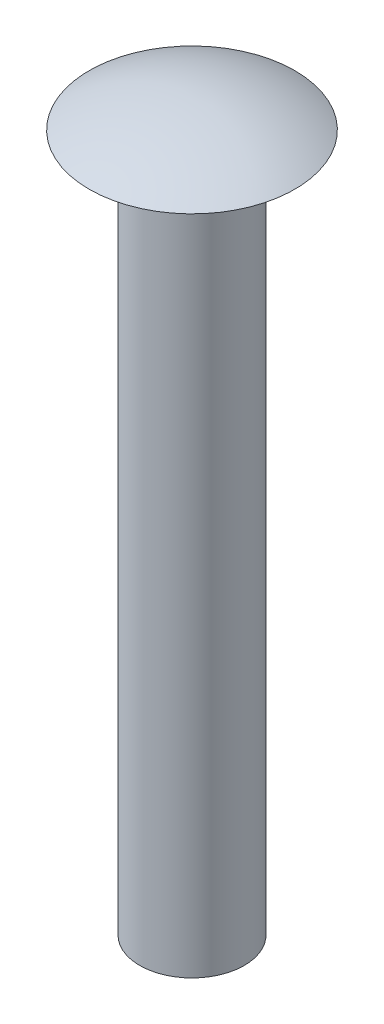
ISO-10303-21;
HEADER;
FILE_DESCRIPTION(('STEP AP214'),'2;1');
FILE_NAME('part.step','',(''),(''),'','','');
FILE_SCHEMA(('AUTOMOTIVE_DESIGN { 1 0 10303 214 1 1 1 1 }'));
ENDSEC;
DATA;
#1=APPLICATION_CONTEXT('core data for automotive mechanical design processes');
#2=APPLICATION_PROTOCOL_DEFINITION('international standard','automotive_design',2000,#1);
#3=PRODUCT_CONTEXT('',#1,'mechanical');
#4=PRODUCT('Part','Part','',(#3));
#5=PRODUCT_RELATED_PRODUCT_CATEGORY('part','',(#4));
#6=PRODUCT_DEFINITION_FORMATION('','',#4);
#7=PRODUCT_DEFINITION_CONTEXT('part definition',#1,'design');
#8=PRODUCT_DEFINITION('design','',#6,#7);
#9=PRODUCT_DEFINITION_SHAPE('','',#8);
#10=(LENGTH_UNIT() NAMED_UNIT(*) SI_UNIT(.MILLI.,.METRE.));
#11=(NAMED_UNIT(*) PLANE_ANGLE_UNIT() SI_UNIT($,.RADIAN.));
#12=(NAMED_UNIT(*) SI_UNIT($,.STERADIAN.) SOLID_ANGLE_UNIT());
#13=UNCERTAINTY_MEASURE_WITH_UNIT(LENGTH_MEASURE(1.E-05),#10,'distance_accuracy_value','');
#14=(GEOMETRIC_REPRESENTATION_CONTEXT(3) GLOBAL_UNCERTAINTY_ASSIGNED_CONTEXT((#13)) GLOBAL_UNIT_ASSIGNED_CONTEXT((#10,
#11,#12)) REPRESENTATION_CONTEXT('',''));
#15=CARTESIAN_POINT('',(0.,0.,0.));
#16=DIRECTION('',(0.,0.,1.));
#17=DIRECTION('',(1.,0.,0.));
#18=AXIS2_PLACEMENT_3D('',#15,#16,#17);
#19=CARTESIAN_POINT('',(0.,7.17329545454546,0.));
#20=DIRECTION('',(0.,-1.,0.));
#21=DIRECTION('',(0.,0.,-1.));
#22=AXIS2_PLACEMENT_3D('',#19,#20,#21);
#23=PLANE('',#22);
#24=CARTESIAN_POINT('',(0.,7.17329545454546,0.749999999999999));
#25=DIRECTION('',(0.,-1.,0.));
#26=DIRECTION('',(0.,0.,-1.));
#27=AXIS2_PLACEMENT_3D('',#24,#25,#26);
#28=CIRCLE('',#27,1.47427121243965);
#29=CARTESIAN_POINT('',(0.,7.17329545454546,-0.724271212439653));
#30=VERTEX_POINT('',#29);
#31=EDGE_CURVE('E10',#30,#30,#28,.T.);
#32=ORIENTED_EDGE('',*,*,#31,.T.);
#33=EDGE_LOOP('',(#32));
#34=FACE_BOUND('',#33,.T.);
#35=CARTESIAN_POINT('',(0.,7.17329545454546,0.749999999999999));
#36=DIRECTION('',(0.,-1.,0.));
#37=DIRECTION('',(0.,0.,-1.));
#38=AXIS2_PLACEMENT_3D('',#35,#36,#37);
#39=CIRCLE('',#38,0.749999999999998);
#40=CARTESIAN_POINT('',(0.,7.17329545454546,0.));
#41=VERTEX_POINT('',#40);
#42=EDGE_CURVE('E43',#41,#41,#39,.T.);
#43=ORIENTED_EDGE('',*,*,#42,.F.);
#44=EDGE_LOOP('',(#43));
#45=FACE_BOUND('',#44,.T.);
#46=ADVANCED_FACE('F33',(#34,#45),#23,.T.);
#47=CARTESIAN_POINT('',(0.,4.56053362227453,0.749999999999999));
#48=DIRECTION('',(0.,-1.,0.));
#49=DIRECTION('',(0.,0.,-1.));
#50=AXIS2_PLACEMENT_3D('',#47,#48,#49);
#51=SPHERICAL_SURFACE('',#50,3.);
#52=ORIENTED_EDGE('',*,*,#31,.F.);
#53=EDGE_LOOP('',(#52));
#54=FACE_BOUND('',#53,.T.);
#55=ADVANCED_FACE('F54',(#54),#51,.T.);
#56=CARTESIAN_POINT('',(0.,-2.82670454545455,0.));
#57=DIRECTION('',(0.,-1.,0.));
#58=DIRECTION('',(0.,0.,-1.));
#59=AXIS2_PLACEMENT_3D('',#56,#57,#58);
#60=PLANE('',#59);
#61=CARTESIAN_POINT('',(0.,-2.82670454545455,0.749999999999999));
#62=DIRECTION('',(0.,-1.,0.));
#63=DIRECTION('',(0.,0.,-1.));
#64=AXIS2_PLACEMENT_3D('',#61,#62,#63);
#65=CIRCLE('',#64,0.749999999999999);
#66=CARTESIAN_POINT('',(0.,-2.82670454545455,0.));
#67=VERTEX_POINT('',#66);
#68=EDGE_CURVE('E39',#67,#67,#65,.T.);
#69=ORIENTED_EDGE('',*,*,#68,.T.);
#70=EDGE_LOOP('',(#69));
#71=FACE_BOUND('',#70,.T.);
#72=ADVANCED_FACE('F58',(#71),#60,.T.);
#73=CARTESIAN_POINT('',(0.,-2.82670454545455,0.749999999999999));
#74=DIRECTION('',(0.,-1.,0.));
#75=DIRECTION('',(0.,0.,-1.));
#76=AXIS2_PLACEMENT_3D('',#73,#74,#75);
#77=CYLINDRICAL_SURFACE('',#76,0.749999999999999);
#78=ORIENTED_EDGE('',*,*,#42,.T.);
#79=EDGE_LOOP('',(#78));
#80=FACE_BOUND('',#79,.T.);
#81=ORIENTED_EDGE('',*,*,#68,.F.);
#82=EDGE_LOOP('',(#81));
#83=FACE_BOUND('',#82,.T.);
#84=ADVANCED_FACE('F50',(#80,#83),#77,.T.);
#85=CLOSED_SHELL('',(#46,#55,#72,#84));
#86=MANIFOLD_SOLID_BREP('B2',#85);
#87=ADVANCED_BREP_SHAPE_REPRESENTATION('',(#18,#86),#14);
#88=SHAPE_DEFINITION_REPRESENTATION(#9,#87);
ENDSEC;
END-ISO-10303-21;
